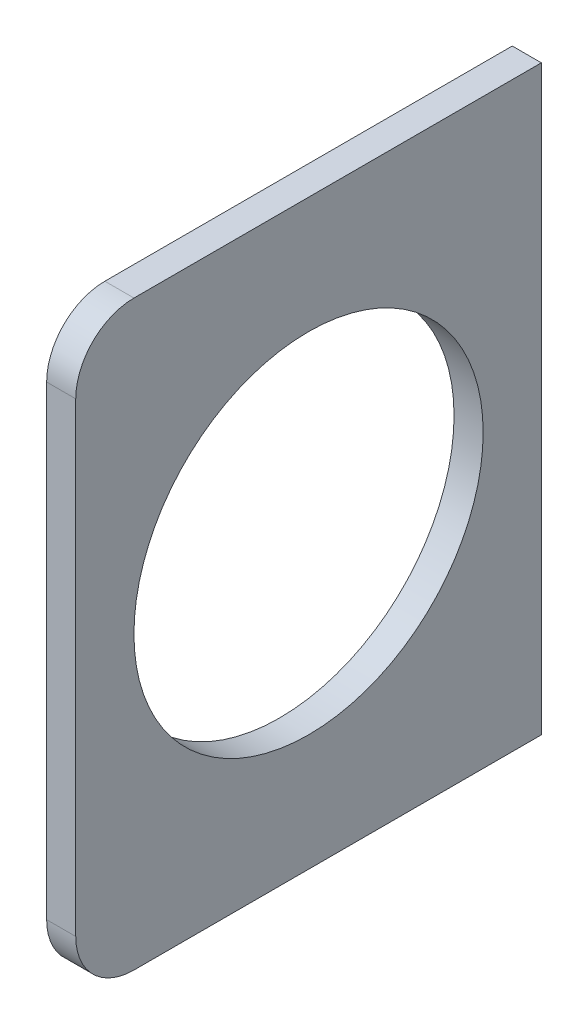
ISO-10303-21;
HEADER;
FILE_DESCRIPTION(('STEP AP214'),'2;1');
FILE_NAME('part.step','',(''),(''),'','','');
FILE_SCHEMA(('AUTOMOTIVE_DESIGN { 1 0 10303 214 1 1 1 1 }'));
ENDSEC;
DATA;
#1=APPLICATION_CONTEXT('core data for automotive mechanical design processes');
#2=APPLICATION_PROTOCOL_DEFINITION('international standard','automotive_design',2000,#1);
#3=PRODUCT_CONTEXT('',#1,'mechanical');
#4=PRODUCT('Part','Part','',(#3));
#5=PRODUCT_RELATED_PRODUCT_CATEGORY('part','',(#4));
#6=PRODUCT_DEFINITION_FORMATION('','',#4);
#7=PRODUCT_DEFINITION_CONTEXT('part definition',#1,'design');
#8=PRODUCT_DEFINITION('design','',#6,#7);
#9=PRODUCT_DEFINITION_SHAPE('','',#8);
#10=(LENGTH_UNIT() NAMED_UNIT(*) SI_UNIT(.MILLI.,.METRE.));
#11=(NAMED_UNIT(*) PLANE_ANGLE_UNIT() SI_UNIT($,.RADIAN.));
#12=(NAMED_UNIT(*) SI_UNIT($,.STERADIAN.) SOLID_ANGLE_UNIT());
#13=UNCERTAINTY_MEASURE_WITH_UNIT(LENGTH_MEASURE(1.E-05),#10,'distance_accuracy_value','');
#14=(GEOMETRIC_REPRESENTATION_CONTEXT(3) GLOBAL_UNCERTAINTY_ASSIGNED_CONTEXT((#13)) GLOBAL_UNIT_ASSIGNED_CONTEXT((#10,
#11,#12)) REPRESENTATION_CONTEXT('',''));
#15=CARTESIAN_POINT('',(0.,0.,0.));
#16=DIRECTION('',(0.,0.,1.));
#17=DIRECTION('',(1.,0.,0.));
#18=AXIS2_PLACEMENT_3D('',#15,#16,#17);
#19=CARTESIAN_POINT('',(100.,3.70868459498297E-07,98.9704558401798));
#20=DIRECTION('',(1.,0.,0.));
#21=DIRECTION('',(0.,0.,-1.));
#22=AXIS2_PLACEMENT_3D('',#19,#20,#21);
#23=PLANE('',#22);
#24=CARTESIAN_POINT('',(100.,3.70868463051011E-07,99.9999995536509));
#25=DIRECTION('',(1.,0.,0.));
#26=DIRECTION('',(0.,0.,-1.));
#27=AXIS2_PLACEMENT_3D('',#24,#25,#26);
#28=CIRCLE('',#27,30.);
#29=CARTESIAN_POINT('',(100.,3.70868463051011E-07,69.9999995536509));
#30=VERTEX_POINT('',#29);
#31=EDGE_CURVE('E110',#30,#30,#28,.F.);
#32=ORIENTED_EDGE('',*,*,#31,.T.);
#33=EDGE_LOOP('',(#32));
#34=FACE_BOUND('',#33,.T.);
#35=DIRECTION('',(0.,0.,-1.));
#36=VECTOR('',#35,1.);
#37=CARTESIAN_POINT('',(100.,-49.9999996291315,94.9999995536509));
#38=LINE('',#37,#36);
#39=CARTESIAN_POINT('',(100.,-49.9999996291315,59.9999995536509));
#40=VERTEX_POINT('',#39);
#41=CARTESIAN_POINT('',(100.,-49.9999996291315,129.999999553651));
#42=VERTEX_POINT('',#41);
#43=EDGE_CURVE('E62',#40,#42,#38,.F.);
#44=ORIENTED_EDGE('',*,*,#43,.F.);
#45=DIRECTION('',(0.,1.,0.));
#46=VECTOR('',#45,1.);
#47=CARTESIAN_POINT('',(100.,3.70868463051011E-07,59.9999995536509));
#48=LINE('',#47,#46);
#49=CARTESIAN_POINT('',(100.,50.0000003708685,59.9999995536509));
#50=VERTEX_POINT('',#49);
#51=EDGE_CURVE('E99',#50,#40,#48,.F.);
#52=ORIENTED_EDGE('',*,*,#51,.F.);
#53=DIRECTION('',(0.,0.,1.));
#54=VECTOR('',#53,1.);
#55=CARTESIAN_POINT('',(100.,50.0000003708685,94.9999995536509));
#56=LINE('',#55,#54);
#57=CARTESIAN_POINT('',(100.,50.0000003708685,129.999999553651));
#58=VERTEX_POINT('',#57);
#59=EDGE_CURVE('E92',#58,#50,#56,.F.);
#60=ORIENTED_EDGE('',*,*,#59,.F.);
#61=CARTESIAN_POINT('',(100.,40.0000003708685,129.999999553651));
#62=DIRECTION('',(1.,0.,0.));
#63=DIRECTION('',(0.,0.,-1.));
#64=AXIS2_PLACEMENT_3D('',#61,#62,#63);
#65=CIRCLE('',#64,10.);
#66=CARTESIAN_POINT('',(100.,40.0000003708685,139.999999553651));
#67=VERTEX_POINT('',#66);
#68=EDGE_CURVE('E79',#67,#58,#65,.F.);
#69=ORIENTED_EDGE('',*,*,#68,.F.);
#70=DIRECTION('',(0.,1.,0.));
#71=VECTOR('',#70,1.);
#72=CARTESIAN_POINT('',(100.,3.70868463051011E-07,139.999999553651));
#73=LINE('',#72,#71);
#74=CARTESIAN_POINT('',(100.,-39.9999996291315,139.999999553651));
#75=VERTEX_POINT('',#74);
#76=EDGE_CURVE('E76',#75,#67,#73,.T.);
#77=ORIENTED_EDGE('',*,*,#76,.F.);
#78=CARTESIAN_POINT('',(100.,-39.9999996291315,129.999999553651));
#79=DIRECTION('',(1.,0.,0.));
#80=DIRECTION('',(0.,0.,-1.));
#81=AXIS2_PLACEMENT_3D('',#78,#79,#80);
#82=CIRCLE('',#81,10.);
#83=EDGE_CURVE('E19',#42,#75,#82,.F.);
#84=ORIENTED_EDGE('',*,*,#83,.F.);
#85=EDGE_LOOP('',(#44,#52,#60,#69,#77,#84));
#86=FACE_BOUND('',#85,.T.);
#87=ADVANCED_FACE('F16',(#34,#86),#23,.T.);
#88=CARTESIAN_POINT('',(95.,3.70868463051011E-07,139.999999553651));
#89=DIRECTION('',(0.,0.,1.));
#90=DIRECTION('',(1.,0.,0.));
#91=AXIS2_PLACEMENT_3D('',#88,#89,#90);
#92=PLANE('',#91);
#93=DIRECTION('',(0.,1.,0.));
#94=VECTOR('',#93,1.);
#95=CARTESIAN_POINT('',(95.,3.70868459498297E-07,139.999999553651));
#96=LINE('',#95,#94);
#97=CARTESIAN_POINT('',(95.,40.0000003708685,139.999999553651));
#98=VERTEX_POINT('',#97);
#99=CARTESIAN_POINT('',(95.,-39.9999996291315,139.999999553651));
#100=VERTEX_POINT('',#99);
#101=EDGE_CURVE('E86',#98,#100,#96,.F.);
#102=ORIENTED_EDGE('',*,*,#101,.T.);
#103=DIRECTION('',(1.,0.,0.));
#104=VECTOR('',#103,1.);
#105=CARTESIAN_POINT('',(95.,-39.9999996291315,139.999999553651));
#106=LINE('',#105,#104);
#107=EDGE_CURVE('E72',#75,#100,#106,.F.);
#108=ORIENTED_EDGE('',*,*,#107,.F.);
#109=ORIENTED_EDGE('',*,*,#76,.T.);
#110=DIRECTION('',(1.,0.,0.));
#111=VECTOR('',#110,1.);
#112=CARTESIAN_POINT('',(95.,40.0000003708685,139.999999553651));
#113=LINE('',#112,#111);
#114=EDGE_CURVE('E112',#98,#67,#113,.T.);
#115=ORIENTED_EDGE('',*,*,#114,.F.);
#116=EDGE_LOOP('',(#102,#108,#109,#115));
#117=FACE_BOUND('',#116,.T.);
#118=ADVANCED_FACE('F85',(#117),#92,.T.);
#119=CARTESIAN_POINT('',(95.,-39.9999996291315,129.999999553651));
#120=DIRECTION('',(1.,0.,0.));
#121=DIRECTION('',(0.,0.,-1.));
#122=AXIS2_PLACEMENT_3D('',#119,#120,#121);
#123=CYLINDRICAL_SURFACE('',#122,10.);
#124=CARTESIAN_POINT('',(95.,-39.9999996291315,129.999999553651));
#125=DIRECTION('',(1.,0.,0.));
#126=DIRECTION('',(0.,0.,-1.));
#127=AXIS2_PLACEMENT_3D('',#124,#125,#126);
#128=CIRCLE('',#127,10.);
#129=CARTESIAN_POINT('',(95.,-49.9999996291315,129.999999553651));
#130=VERTEX_POINT('',#129);
#131=EDGE_CURVE('E107',#100,#130,#128,.T.);
#132=ORIENTED_EDGE('',*,*,#131,.T.);
#133=DIRECTION('',(1.,0.,0.));
#134=VECTOR('',#133,1.);
#135=CARTESIAN_POINT('',(95.,-49.9999996291315,129.999999553651));
#136=LINE('',#135,#134);
#137=EDGE_CURVE('E74',#42,#130,#136,.F.);
#138=ORIENTED_EDGE('',*,*,#137,.F.);
#139=ORIENTED_EDGE('',*,*,#83,.T.);
#140=ORIENTED_EDGE('',*,*,#107,.T.);
#141=EDGE_LOOP('',(#132,#138,#139,#140));
#142=FACE_BOUND('',#141,.T.);
#143=ADVANCED_FACE('F70',(#142),#123,.T.);
#144=CARTESIAN_POINT('',(95.,-49.9999996291315,94.9999995536509));
#145=DIRECTION('',(0.,-1.,0.));
#146=DIRECTION('',(0.,0.,-1.));
#147=AXIS2_PLACEMENT_3D('',#144,#145,#146);
#148=PLANE('',#147);
#149=DIRECTION('',(0.,0.,-1.));
#150=VECTOR('',#149,1.);
#151=CARTESIAN_POINT('',(95.,-49.9999996291315,98.9704558401798));
#152=LINE('',#151,#150);
#153=CARTESIAN_POINT('',(95.,-49.9999996291315,59.9999995536509));
#154=VERTEX_POINT('',#153);
#155=EDGE_CURVE('E109',#130,#154,#152,.T.);
#156=ORIENTED_EDGE('',*,*,#155,.T.);
#157=DIRECTION('',(-1.,0.,0.));
#158=VECTOR('',#157,1.);
#159=CARTESIAN_POINT('',(95.,-49.9999996291315,59.9999995536509));
#160=LINE('',#159,#158);
#161=EDGE_CURVE('E96',#40,#154,#160,.T.);
#162=ORIENTED_EDGE('',*,*,#161,.F.);
#163=ORIENTED_EDGE('',*,*,#43,.T.);
#164=ORIENTED_EDGE('',*,*,#137,.T.);
#165=EDGE_LOOP('',(#156,#162,#163,#164));
#166=FACE_BOUND('',#165,.T.);
#167=ADVANCED_FACE('F139',(#166),#148,.T.);
#168=CARTESIAN_POINT('',(95.,3.70868463051011E-07,59.9999995536509));
#169=DIRECTION('',(0.,0.,-1.));
#170=DIRECTION('',(-1.,0.,0.));
#171=AXIS2_PLACEMENT_3D('',#168,#169,#170);
#172=PLANE('',#171);
#173=DIRECTION('',(0.,1.,0.));
#174=VECTOR('',#173,1.);
#175=CARTESIAN_POINT('',(95.,3.70868459498297E-07,59.9999995536509));
#176=LINE('',#175,#174);
#177=CARTESIAN_POINT('',(95.,50.0000003708685,59.9999995536509));
#178=VERTEX_POINT('',#177);
#179=EDGE_CURVE('E123',#154,#178,#176,.T.);
#180=ORIENTED_EDGE('',*,*,#179,.T.);
#181=DIRECTION('',(1.,0.,0.));
#182=VECTOR('',#181,1.);
#183=CARTESIAN_POINT('',(95.,50.0000003708685,59.9999995536509));
#184=LINE('',#183,#182);
#185=EDGE_CURVE('E95',#50,#178,#184,.F.);
#186=ORIENTED_EDGE('',*,*,#185,.F.);
#187=ORIENTED_EDGE('',*,*,#51,.T.);
#188=ORIENTED_EDGE('',*,*,#161,.T.);
#189=EDGE_LOOP('',(#180,#186,#187,#188));
#190=FACE_BOUND('',#189,.T.);
#191=ADVANCED_FACE('F132',(#190),#172,.T.);
#192=CARTESIAN_POINT('',(95.,50.0000003708685,94.9999995536509));
#193=DIRECTION('',(0.,1.,0.));
#194=DIRECTION('',(0.,0.,1.));
#195=AXIS2_PLACEMENT_3D('',#192,#193,#194);
#196=PLANE('',#195);
#197=DIRECTION('',(0.,0.,-1.));
#198=VECTOR('',#197,1.);
#199=CARTESIAN_POINT('',(95.,50.0000003708685,98.9704558401798));
#200=LINE('',#199,#198);
#201=CARTESIAN_POINT('',(95.,50.0000003708685,129.999999553651));
#202=VERTEX_POINT('',#201);
#203=EDGE_CURVE('E106',#178,#202,#200,.F.);
#204=ORIENTED_EDGE('',*,*,#203,.T.);
#205=DIRECTION('',(1.,0.,0.));
#206=VECTOR('',#205,1.);
#207=CARTESIAN_POINT('',(95.,50.0000003708685,129.999999553651));
#208=LINE('',#207,#206);
#209=EDGE_CURVE('E34',#58,#202,#208,.F.);
#210=ORIENTED_EDGE('',*,*,#209,.F.);
#211=ORIENTED_EDGE('',*,*,#59,.T.);
#212=ORIENTED_EDGE('',*,*,#185,.T.);
#213=EDGE_LOOP('',(#204,#210,#211,#212));
#214=FACE_BOUND('',#213,.T.);
#215=ADVANCED_FACE('F147',(#214),#196,.T.);
#216=CARTESIAN_POINT('',(95.,40.0000003708685,129.999999553651));
#217=DIRECTION('',(1.,0.,0.));
#218=DIRECTION('',(0.,0.,-1.));
#219=AXIS2_PLACEMENT_3D('',#216,#217,#218);
#220=CYLINDRICAL_SURFACE('',#219,10.);
#221=CARTESIAN_POINT('',(95.,40.0000003708685,129.999999553651));
#222=DIRECTION('',(1.,0.,0.));
#223=DIRECTION('',(0.,0.,-1.));
#224=AXIS2_PLACEMENT_3D('',#221,#222,#223);
#225=CIRCLE('',#224,10.);
#226=EDGE_CURVE('E25',#202,#98,#225,.T.);
#227=ORIENTED_EDGE('',*,*,#226,.T.);
#228=ORIENTED_EDGE('',*,*,#114,.T.);
#229=ORIENTED_EDGE('',*,*,#68,.T.);
#230=ORIENTED_EDGE('',*,*,#209,.T.);
#231=EDGE_LOOP('',(#227,#228,#229,#230));
#232=FACE_BOUND('',#231,.T.);
#233=ADVANCED_FACE('F149',(#232),#220,.T.);
#234=CARTESIAN_POINT('',(95.,3.70868463051011E-07,99.9999995536509));
#235=DIRECTION('',(1.,0.,0.));
#236=DIRECTION('',(0.,0.,-1.));
#237=AXIS2_PLACEMENT_3D('',#234,#235,#236);
#238=CYLINDRICAL_SURFACE('',#237,30.);
#239=ORIENTED_EDGE('',*,*,#31,.F.);
#240=EDGE_LOOP('',(#239));
#241=FACE_BOUND('',#240,.T.);
#242=CARTESIAN_POINT('',(95.,3.70868463051011E-07,99.9999995536509));
#243=DIRECTION('',(1.,0.,0.));
#244=DIRECTION('',(0.,0.,-1.));
#245=AXIS2_PLACEMENT_3D('',#242,#243,#244);
#246=CIRCLE('',#245,30.);
#247=CARTESIAN_POINT('',(95.,3.70868463051011E-07,69.9999995536509));
#248=VERTEX_POINT('',#247);
#249=EDGE_CURVE('E10',#248,#248,#246,.F.);
#250=ORIENTED_EDGE('',*,*,#249,.T.);
#251=EDGE_LOOP('',(#250));
#252=FACE_BOUND('',#251,.T.);
#253=ADVANCED_FACE('F156',(#241,#252),#238,.F.);
#254=CARTESIAN_POINT('',(95.,3.70868459498297E-07,98.9704558401798));
#255=DIRECTION('',(1.,0.,0.));
#256=DIRECTION('',(0.,0.,-1.));
#257=AXIS2_PLACEMENT_3D('',#254,#255,#256);
#258=PLANE('',#257);
#259=ORIENTED_EDGE('',*,*,#249,.F.);
#260=EDGE_LOOP('',(#259));
#261=FACE_BOUND('',#260,.T.);
#262=ORIENTED_EDGE('',*,*,#203,.F.);
#263=ORIENTED_EDGE('',*,*,#179,.F.);
#264=ORIENTED_EDGE('',*,*,#155,.F.);
#265=ORIENTED_EDGE('',*,*,#131,.F.);
#266=ORIENTED_EDGE('',*,*,#101,.F.);
#267=ORIENTED_EDGE('',*,*,#226,.F.);
#268=EDGE_LOOP('',(#262,#263,#264,#265,#266,#267));
#269=FACE_BOUND('',#268,.T.);
#270=ADVANCED_FACE('F138',(#261,#269),#258,.F.);
#271=CLOSED_SHELL('',(#87,#118,#143,#167,#191,#215,#233,#253,#270));
#272=MANIFOLD_SOLID_BREP('B1',#271);
#273=ADVANCED_BREP_SHAPE_REPRESENTATION('',(#18,#272),#14);
#274=SHAPE_DEFINITION_REPRESENTATION(#9,#273);
ENDSEC;
END-ISO-10303-21;
